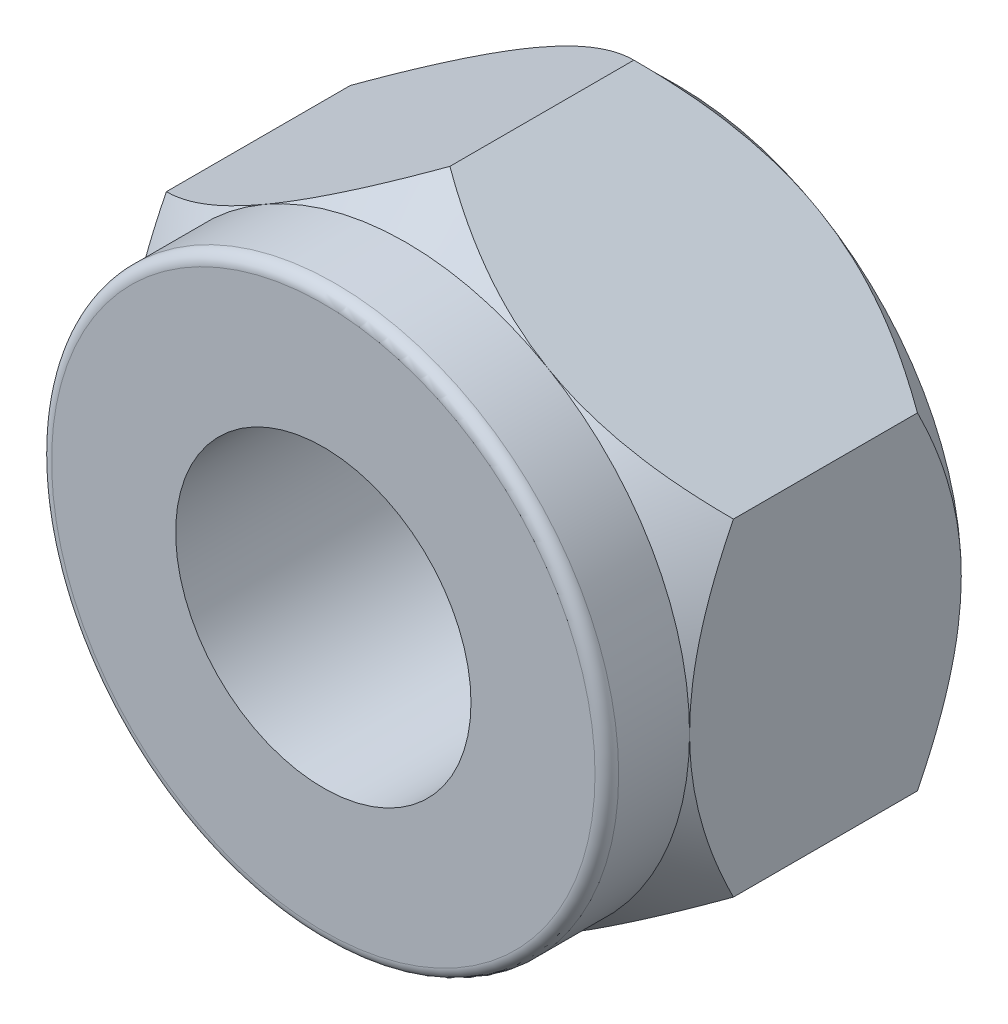
ISO-10303-21;
HEADER;
FILE_DESCRIPTION(('STEP AP214'),'2;1');
FILE_NAME('part.step','',(''),(''),'','','');
FILE_SCHEMA(('AUTOMOTIVE_DESIGN { 1 0 10303 214 1 1 1 1 }'));
ENDSEC;
DATA;
#1=APPLICATION_CONTEXT('core data for automotive mechanical design processes');
#2=APPLICATION_PROTOCOL_DEFINITION('international standard','automotive_design',2000,#1);
#3=PRODUCT_CONTEXT('',#1,'mechanical');
#4=PRODUCT('Part','Part','',(#3));
#5=PRODUCT_RELATED_PRODUCT_CATEGORY('part','',(#4));
#6=PRODUCT_DEFINITION_FORMATION('','',#4);
#7=PRODUCT_DEFINITION_CONTEXT('part definition',#1,'design');
#8=PRODUCT_DEFINITION('design','',#6,#7);
#9=PRODUCT_DEFINITION_SHAPE('','',#8);
#10=(LENGTH_UNIT() NAMED_UNIT(*) SI_UNIT(.MILLI.,.METRE.));
#11=(NAMED_UNIT(*) PLANE_ANGLE_UNIT() SI_UNIT($,.RADIAN.));
#12=(NAMED_UNIT(*) SI_UNIT($,.STERADIAN.) SOLID_ANGLE_UNIT());
#13=UNCERTAINTY_MEASURE_WITH_UNIT(LENGTH_MEASURE(1.E-05),#10,'distance_accuracy_value','');
#14=(GEOMETRIC_REPRESENTATION_CONTEXT(3) GLOBAL_UNCERTAINTY_ASSIGNED_CONTEXT((#13)) GLOBAL_UNIT_ASSIGNED_CONTEXT((#10,
#11,#12)) REPRESENTATION_CONTEXT('',''));
#15=CARTESIAN_POINT('',(0.,0.,0.));
#16=DIRECTION('',(0.,0.,1.));
#17=DIRECTION('',(1.,0.,0.));
#18=AXIS2_PLACEMENT_3D('',#15,#16,#17);
#19=CARTESIAN_POINT('',(2.4,1.3856406460551,2.3));
#20=DIRECTION('',(-0.5,-0.866025403784439,0.));
#21=DIRECTION('',(0.866025403784439,-0.5,0.));
#22=AXIS2_PLACEMENT_3D('',#19,#20,#21);
#23=PLANE('',#22);
#24=CARTESIAN_POINT('',(2.400225,1.38551074224453,1.9285887949458));
#25=CARTESIAN_POINT('',(2.31772226361059,1.43314371930784,1.97618269691781));
#26=CARTESIAN_POINT('',(2.23383994260048,1.48157319992328,2.02098147814882));
#27=CARTESIAN_POINT('',(2.06279448648971,1.58032634005249,2.10300722565923));
#28=CARTESIAN_POINT('',(1.97561508192357,1.63065939274654,2.14018854883754));
#29=CARTESIAN_POINT('',(1.79982194236265,1.73215360919373,2.20388101805169));
#30=CARTESIAN_POINT('',(1.7112529842582,1.78328892099718,2.23055226488237));
#31=CARTESIAN_POINT('',(1.53216510134971,1.886685358403,2.27164498132732));
#32=CARTESIAN_POINT('',(1.44165164852085,1.93894332475902,2.28609712881476));
#33=CARTESIAN_POINT('',(1.28565873476605,2.02900587550703,2.29913661889426));
#34=CARTESIAN_POINT('',(1.22038083817508,2.06669408667596,2.30106703138973));
#35=CARTESIAN_POINT('',(1.08993172717349,2.14200891602828,2.29781589873831));
#36=CARTESIAN_POINT('',(1.02476055818355,2.17963550798802,2.29263186018551));
#37=CARTESIAN_POINT('',(0.89503356361389,2.25453342322397,2.27544682831704));
#38=CARTESIAN_POINT('',(0.830478508767439,2.29180430151712,2.26343820832122));
#39=CARTESIAN_POINT('',(0.702484703713386,2.36570155931969,2.23326320244677));
#40=CARTESIAN_POINT('',(0.639045868327159,2.402327988007,2.21509728859333));
#41=CARTESIAN_POINT('',(0.476545316503685,2.49614772534575,2.16116553425461));
#42=CARTESIAN_POINT('',(0.378491349831642,2.55275920939896,2.12133366599793));
#43=CARTESIAN_POINT('',(0.234311769936506,2.63600132866307,2.05409168986329));
#44=CARTESIAN_POINT('',(0.186798185170518,2.66343330961787,2.03046590242826));
#45=CARTESIAN_POINT('',(0.0926511898287065,2.71778910272186,1.9810606043225));
#46=CARTESIAN_POINT('',(0.0460172600174095,2.74471321465178,1.95528241623806));
#47=CARTESIAN_POINT('',(-0.000224999999999834,2.77141119592077,1.9285887949458));
#48=B_SPLINE_CURVE_WITH_KNOTS('',3,(#24,#25,#26,#27,#28,#29,#30,#31,#32,#33,#34,#35,#36,#37,#38,
#39,#40,#41,#42,#43,#44,#45,#46,#47),.UNSPECIFIED.,.F.,.F.,(4,2,2,2,2,2,2,2,2,2,2,4),(0.,
0.319700631801913,0.641264200293265,0.957720168177908,1.27337924669043,1.49926250316193,
1.72522494529284,1.951440405382,2.17763852745645,2.53695946203074,2.71613279169855,
2.89519682366906),.UNSPECIFIED.);
#49=CARTESIAN_POINT('',(2.4,1.3856406460551,1.9287187078898));
#50=VERTEX_POINT('',#49);
#51=CARTESIAN_POINT('',(1.2,2.07846096908265,2.3));
#52=VERTEX_POINT('',#51);
#53=EDGE_CURVE('E131',#50,#52,#48,.T.);
#54=ORIENTED_EDGE('',*,*,#53,.F.);
#55=DIRECTION('',(0.,0.,-1.));
#56=VECTOR('',#55,1.);
#57=CARTESIAN_POINT('',(2.4,1.3856406460551,2.3));
#58=LINE('',#57,#56);
#59=CARTESIAN_POINT('',(2.4,1.3856406460551,0.371274007665088));
#60=VERTEX_POINT('',#59);
#61=EDGE_CURVE('E160',#50,#60,#58,.T.);
#62=ORIENTED_EDGE('',*,*,#61,.T.);
#63=CARTESIAN_POINT('',(-0.0002,2.77139676216404,0.371389484935504));
#64=CARTESIAN_POINT('',(0.0823012290219648,2.72376465537974,0.323797189948385));
#65=CARTESIAN_POINT('',(0.166182002218614,2.67533606839482,0.278999989178173));
#66=CARTESIAN_POINT('',(0.337224213782115,2.57658480150584,0.196977256711161));
#67=CARTESIAN_POINT('',(0.424401919980798,2.5262527293647,0.159797364335556));
#68=CARTESIAN_POINT('',(0.600191618602269,2.42476049954483,0.0961074141049489));
#69=CARTESIAN_POINT('',(0.688758838546548,2.37362619126862,0.0694372679428527));
#70=CARTESIAN_POINT('',(0.867843133228609,2.2702318255263,0.0283463117495389));
#71=CARTESIAN_POINT('',(0.958354736660034,2.21797492692038,0.0138948268502028));
#72=CARTESIAN_POINT('',(1.11434570656907,2.12791349845225,0.000855887820635021));
#73=CARTESIAN_POINT('',(1.17962353089486,2.09022532900564,-0.00107436222053681));
#74=CARTESIAN_POINT('',(1.31007248382727,2.01491059091461,0.00217707691950548));
#75=CARTESIAN_POINT('',(1.37524356700993,1.97728404849572,0.00736125943327144));
#76=CARTESIAN_POINT('',(1.50497037588312,1.90238624047167,0.0245465518295103));
#77=CARTESIAN_POINT('',(1.56952533088676,1.86511541982279,0.0365552878068237));
#78=CARTESIAN_POINT('',(1.69751893288234,1.7912182792561,0.066730495215164));
#79=CARTESIAN_POINT('',(1.76095766505766,1.75459191015763,0.0848964945983144));
#80=CARTESIAN_POINT('',(1.92345302377046,1.66077517106273,0.1388267974023));
#81=CARTESIAN_POINT('',(2.02150206458703,1.6041665309535,0.178656440753965));
#82=CARTESIAN_POINT('',(2.1656745393029,1.52092851386656,0.245894409608793));
#83=CARTESIAN_POINT('',(2.21318580224688,1.49349787341631,0.269518749879775));
#84=CARTESIAN_POINT('',(2.30732824280802,1.43914471001617,0.318920980646706));
#85=CARTESIAN_POINT('',(2.35395993949604,1.41222188738057,0.344697548957831));
#86=CARTESIAN_POINT('',(2.4002,1.38552517600126,0.371389484935503));
#87=B_SPLINE_CURVE_WITH_KNOTS('',3,(#63,#64,#65,#66,#67,#68,#69,#70,#71,#72,#73,#74,#75,#76,#77,
#78,#79,#80,#81,#82,#83,#84,#85,#86),.UNSPECIFIED.,.F.,.F.,(4,2,2,2,2,2,2,2,2,2,2,4),(0.,
0.319693790797099,0.64125036481395,0.957699700318646,1.2733522128152,1.49923520651956,
1.72519738366798,1.95141256006821,2.17761039755628,2.53691313596383,2.71607736387025,
2.89513232388091),.UNSPECIFIED.);
#88=CARTESIAN_POINT('',(1.20000182111127,2.07846412333992,-3.64222270296016E-06));
#89=VERTEX_POINT('',#88);
#90=EDGE_CURVE('E313',#89,#60,#87,.T.);
#91=ORIENTED_EDGE('',*,*,#90,.F.);
#92=CARTESIAN_POINT('',(0.,2.7712812921102,0.371274007665088));
#93=VERTEX_POINT('',#92);
#94=EDGE_CURVE('E327',#93,#89,#87,.T.);
#95=ORIENTED_EDGE('',*,*,#94,.F.);
#96=DIRECTION('',(0.,0.,-1.));
#97=VECTOR('',#96,1.);
#98=CARTESIAN_POINT('',(0.,2.7712812921102,2.3));
#99=LINE('',#98,#97);
#100=CARTESIAN_POINT('',(0.,2.7712812921102,1.9287187078898));
#101=VERTEX_POINT('',#100);
#102=EDGE_CURVE('E164',#101,#93,#99,.T.);
#103=ORIENTED_EDGE('',*,*,#102,.F.);
#104=EDGE_CURVE('E143',#52,#101,#48,.T.);
#105=ORIENTED_EDGE('',*,*,#104,.F.);
#106=EDGE_LOOP('',(#54,#62,#91,#95,#103,#105));
#107=FACE_BOUND('',#106,.T.);
#108=ADVANCED_FACE('F40',(#107),#23,.F.);
#109=CARTESIAN_POINT('',(0.,2.7712812921102,2.3));
#110=DIRECTION('',(0.5,-0.866025403784439,0.));
#111=DIRECTION('',(0.866025403784438,0.5,0.));
#112=AXIS2_PLACEMENT_3D('',#109,#110,#111);
#113=PLANE('',#112);
#114=CARTESIAN_POINT('',(0.000225000000000114,2.77141119592077,1.9285887949458));
#115=CARTESIAN_POINT('',(-0.0822777363894048,2.72377821885747,1.97618269691781));
#116=CARTESIAN_POINT('',(-0.166160057399522,2.67534873824203,2.02098147814882));
#117=CARTESIAN_POINT('',(-0.337205513510287,2.57659559811281,2.10300722565924));
#118=CARTESIAN_POINT('',(-0.424384918076426,2.52626254541876,2.14018854883754));
#119=CARTESIAN_POINT('',(-0.600178057637348,2.42476832897157,2.20388101805169));
#120=CARTESIAN_POINT('',(-0.688747015741804,2.37363301716812,2.23055226488237));
#121=CARTESIAN_POINT('',(-0.867834898650292,2.27023657976231,2.27164498132732));
#122=CARTESIAN_POINT('',(-0.958348351479144,2.21797861340629,2.28609712881476));
#123=CARTESIAN_POINT('',(-1.11434126523395,2.12791606265827,2.29913661889426));
#124=CARTESIAN_POINT('',(-1.17961916182492,2.09022785148934,2.30106703138973));
#125=CARTESIAN_POINT('',(-1.31006827282651,2.01491302213703,2.29781589873831));
#126=CARTESIAN_POINT('',(-1.37523944181645,1.97728643017728,2.29263186018552));
#127=CARTESIAN_POINT('',(-1.50496643638611,1.90238851494133,2.27544682831704));
#128=CARTESIAN_POINT('',(-1.56952149123256,1.86511763664818,2.26343820832122));
#129=CARTESIAN_POINT('',(-1.69751529628661,1.79122037884562,2.23326320244677));
#130=CARTESIAN_POINT('',(-1.76095413167284,1.75459395015831,2.21509728859333));
#131=CARTESIAN_POINT('',(-1.92345468349631,1.66077421281956,2.16116553425461));
#132=CARTESIAN_POINT('',(-2.02150865016836,1.60416272876634,2.12133366599793));
#133=CARTESIAN_POINT('',(-2.16568823006349,1.52092060950224,2.05409168986329));
#134=CARTESIAN_POINT('',(-2.21320181482948,1.49348862854743,2.03046590242826));
#135=CARTESIAN_POINT('',(-2.30734881017129,1.43913283544344,1.9810606043225));
#136=CARTESIAN_POINT('',(-2.35398273998259,1.41220872351352,1.95528241623806));
#137=CARTESIAN_POINT('',(-2.400225,1.38551074224453,1.9285887949458));
#138=B_SPLINE_CURVE_WITH_KNOTS('',3,(#114,#115,#116,#117,#118,#119,#120,#121,#122,#123,#124,
#125,#126,#127,#128,#129,#130,#131,#132,#133,#134,#135,#136,#137),.UNSPECIFIED.,.F.,.F.,(4,2,2,
2,2,2,2,2,2,2,2,4),(0.,0.319700631801913,0.641264200293264,0.957720168177907,1.27337924669043,
1.49926250316193,1.72522494529284,1.951440405382,2.17763852745645,2.53695946203074,
2.71613279169855,2.89519682366906),.UNSPECIFIED.);
#139=CARTESIAN_POINT('',(-1.2,2.07846096908265,2.3));
#140=VERTEX_POINT('',#139);
#141=EDGE_CURVE('E150',#101,#140,#138,.T.);
#142=ORIENTED_EDGE('',*,*,#141,.F.);
#143=ORIENTED_EDGE('',*,*,#102,.T.);
#144=CARTESIAN_POINT('',(-2.4002,1.38552517600126,0.371389484935503));
#145=CARTESIAN_POINT('',(-2.31769877097804,1.43315728278557,0.323797189948385));
#146=CARTESIAN_POINT('',(-2.23381799778139,1.48158586977049,0.278999989178173));
#147=CARTESIAN_POINT('',(-2.06277578621789,1.58033713665947,0.196977256711161));
#148=CARTESIAN_POINT('',(-1.9755980800192,1.63066920880061,0.159797364335555));
#149=CARTESIAN_POINT('',(-1.79980838139773,1.73216143862048,0.0961074141049486));
#150=CARTESIAN_POINT('',(-1.71124116145345,1.78329574689669,0.0694372679428527));
#151=CARTESIAN_POINT('',(-1.53215686677139,1.88669011263901,0.0283463117495388));
#152=CARTESIAN_POINT('',(-1.44164526333997,1.93894701124492,0.0138948268502023));
#153=CARTESIAN_POINT('',(-1.28565429343093,2.02900843971306,0.000855887820634611));
#154=CARTESIAN_POINT('',(-1.22037646910515,2.06669660915966,-0.00107436222053701));
#155=CARTESIAN_POINT('',(-1.08992751617273,2.1420113472507,0.00217707691950525));
#156=CARTESIAN_POINT('',(-1.02475643299007,2.17963788966959,0.00736125943327096));
#157=CARTESIAN_POINT('',(-0.895029624116876,2.25453569769364,0.0245465518295099));
#158=CARTESIAN_POINT('',(-0.830474669113238,2.29180651834251,0.0365552878068237));
#159=CARTESIAN_POINT('',(-0.702481067117664,2.36570365890921,0.0667304952151638));
#160=CARTESIAN_POINT('',(-0.639042334942346,2.40233002800767,0.0848964945983138));
#161=CARTESIAN_POINT('',(-0.476546976229544,2.49614676710257,0.138826797402299));
#162=CARTESIAN_POINT('',(-0.378497935412973,2.55275540721181,0.178656440753965));
#163=CARTESIAN_POINT('',(-0.234325460697104,2.63599342429875,0.245894409608793));
#164=CARTESIAN_POINT('',(-0.186814197753125,2.66342406474899,0.269518749879774));
#165=CARTESIAN_POINT('',(-0.0926717571919817,2.71777722814914,0.318920980646706));
#166=CARTESIAN_POINT('',(-0.0460400605039591,2.74470005078474,0.344697548957831));
#167=CARTESIAN_POINT('',(0.000200000000000176,2.77139676216404,0.371389484935504));
#168=B_SPLINE_CURVE_WITH_KNOTS('',3,(#144,#145,#146,#147,#148,#149,#150,#151,#152,#153,#154,
#155,#156,#157,#158,#159,#160,#161,#162,#163,#164,#165,#166,#167),.UNSPECIFIED.,.F.,.F.,(4,2,2,
2,2,2,2,2,2,2,2,4),(0.,0.319693790797099,0.64125036481395,0.957699700318646,1.2733522128152,
1.49923520651956,1.72519738366798,1.95141256006821,2.17761039755628,2.53691313596383,
2.71607736387025,2.89513232388091),.UNSPECIFIED.);
#169=CARTESIAN_POINT('',(-1.20000182111129,2.07846412333991,-3.64222270290595E-06));
#170=VERTEX_POINT('',#169);
#171=EDGE_CURVE('E441',#170,#93,#168,.T.);
#172=ORIENTED_EDGE('',*,*,#171,.F.);
#173=CARTESIAN_POINT('',(-2.4,1.3856406460551,0.371274007665088));
#174=VERTEX_POINT('',#173);
#175=EDGE_CURVE('E433',#174,#170,#168,.T.);
#176=ORIENTED_EDGE('',*,*,#175,.F.);
#177=DIRECTION('',(0.,0.,-1.));
#178=VECTOR('',#177,1.);
#179=CARTESIAN_POINT('',(-2.4,1.3856406460551,2.3));
#180=LINE('',#179,#178);
#181=CARTESIAN_POINT('',(-2.4,1.3856406460551,1.9287187078898));
#182=VERTEX_POINT('',#181);
#183=EDGE_CURVE('E278',#182,#174,#180,.T.);
#184=ORIENTED_EDGE('',*,*,#183,.F.);
#185=EDGE_CURVE('E167',#140,#182,#138,.T.);
#186=ORIENTED_EDGE('',*,*,#185,.F.);
#187=EDGE_LOOP('',(#142,#143,#172,#176,#184,#186));
#188=FACE_BOUND('',#187,.T.);
#189=ADVANCED_FACE('F229',(#188),#113,.F.);
#190=CARTESIAN_POINT('',(-2.4,1.3856406460551,2.3));
#191=DIRECTION('',(1.,0.,0.));
#192=DIRECTION('',(0.,0.,-1.));
#193=AXIS2_PLACEMENT_3D('',#190,#191,#192);
#194=PLANE('',#193);
#195=CARTESIAN_POINT('',(-2.4,1.3858656460551,1.92860620103968));
#196=CARTESIAN_POINT('',(-2.4,1.29060179063543,1.9761981653612));
#197=CARTESIAN_POINT('',(-2.4,1.19374498442452,2.02099504092357));
#198=CARTESIAN_POINT('',(-2.4,0.996243221547423,2.10301715299163));
#199=CARTESIAN_POINT('',(-2.4,0.895579480795219,2.14019675095386));
#200=CARTESIAN_POINT('',(-2.4,0.692595838719089,2.20388618285687));
#201=CARTESIAN_POINT('',(-2.4,0.590327635151999,2.23055610253527));
#202=CARTESIAN_POINT('',(-2.4,0.383539756226781,2.27164669652072));
#203=CARTESIAN_POINT('',(-2.4,0.279026398430142,2.28609804507758));
#204=CARTESIAN_POINT('',(-2.4,0.0989040033476916,2.29913687071086));
#205=CARTESIAN_POINT('',(-2.4,0.0235276816223925,2.30106708732014));
#206=CARTESIAN_POINT('',(-2.4,-0.127101757006664,2.29781558510622));
#207=CARTESIAN_POINT('',(-2.4,-0.202354821458544,2.29263137296556));
#208=CARTESIAN_POINT('',(-2.4,-0.35215039338856,2.27544602695228));
#209=CARTESIAN_POINT('',(-2.4,-0.426692010965138,2.26343726710527));
#210=CARTESIAN_POINT('',(-2.4,-0.57448624385448,2.23326201821899));
#211=CARTESIAN_POINT('',(-2.4,-0.647738957529669,2.21509600123228));
#212=CARTESIAN_POINT('',(-2.4,-0.835371201794038,2.16116599711134));
#213=CARTESIAN_POINT('',(-2.4,-0.948587311586011,2.12133681158238));
#214=CARTESIAN_POINT('',(-2.4,-1.11506165750506,2.05409966731303));
#215=CARTESIAN_POINT('',(-2.4,-1.16992238671944,2.03047562482769));
#216=CARTESIAN_POINT('',(-2.4,-1.27862763126161,1.9810740252332));
#217=CARTESIAN_POINT('',(-2.4,-1.33247274592169,1.95529779022629));
#218=CARTESIAN_POINT('',(-2.4,-1.3858656460551,1.92860620103968));
#219=B_SPLINE_CURVE_WITH_KNOTS('',3,(#195,#196,#197,#198,#199,#200,#201,#202,#203,#204,#205,
#206,#207,#208,#209,#210,#211,#212,#213,#214,#215,#216,#217,#218),.UNSPECIFIED.,.F.,.F.,(4,2,2,
2,2,2,2,2,2,2,2,4),(0.,0.31969238314533,0.641247517932364,0.957695488712028,1.27334665013864,
1.49922958978071,1.72519171241104,1.95140683044389,2.17760460937986,2.53690360347334,
2.71606595846664,2.89511905169603),.UNSPECIFIED.);
#220=CARTESIAN_POINT('',(-2.4,0.,2.3));
#221=VERTEX_POINT('',#220);
#222=EDGE_CURVE('E223',#182,#221,#219,.T.);
#223=ORIENTED_EDGE('',*,*,#222,.F.);
#224=ORIENTED_EDGE('',*,*,#183,.T.);
#225=CARTESIAN_POINT('',(-2.4,-4.33202461858635,2.5524100340003));
#226=CARTESIAN_POINT('',(-2.4,-4.20467817352178,2.44105807588942));
#227=CARTESIAN_POINT('',(-2.4,-4.07679375117089,2.33030928191229));
#228=CARTESIAN_POINT('',(-2.4,-3.81952744564485,2.11044929575524));
#229=CARTESIAN_POINT('',(-2.4,-3.69014491727787,2.00133885944401));
#230=CARTESIAN_POINT('',(-2.4,-3.42690641346845,1.78307538860849));
#231=CARTESIAN_POINT('',(-2.4,-3.29301308680823,1.67396723525418));
#232=CARTESIAN_POINT('',(-2.4,-3.02281106446473,1.45883829376592));
#233=CARTESIAN_POINT('',(-2.4,-2.88650297005449,1.35281675397838));
#234=CARTESIAN_POINT('',(-2.4,-2.61051182637548,1.14491981190419));
#235=CARTESIAN_POINT('',(-2.4,-2.47082531257604,1.04304898068681));
#236=CARTESIAN_POINT('',(-2.4,-2.18699883504318,0.84538363520462));
#237=CARTESIAN_POINT('',(-2.4,-2.04285545038019,0.749593969900597));
#238=CARTESIAN_POINT('',(-2.4,-1.74967851022209,0.567851217213569));
#239=CARTESIAN_POINT('',(-2.4,-1.60068134540473,0.48184013955532));
#240=CARTESIAN_POINT('',(-2.4,-1.29531232289618,0.324104551635456));
#241=CARTESIAN_POINT('',(-2.4,-1.13895393419677,0.252355113881703));
#242=CARTESIAN_POINT('',(-2.4,-0.896222228816197,0.160747646978908));
#243=CARTESIAN_POINT('',(-2.4,-0.812972383051711,0.132662179925447));
#244=CARTESIAN_POINT('',(-2.4,-0.644357672516691,0.0836775937029816));
#245=CARTESIAN_POINT('',(-2.4,-0.558993143122039,0.0627773427263272));
#246=CARTESIAN_POINT('',(-2.4,-0.387220462806769,0.0295817076216501));
#247=CARTESIAN_POINT('',(-2.4,-0.30082445531428,0.017224709069998));
#248=CARTESIAN_POINT('',(-2.4,-0.127200799384861,0.00180685336911782));
#249=CARTESIAN_POINT('',(-2.4,-0.0399732855922029,-0.00125548403298988));
#250=CARTESIAN_POINT('',(-2.4,0.134597937865097,0.00217350377839942));
#251=CARTESIAN_POINT('',(-2.4,0.221940968544996,0.00869863414765547));
#252=CARTESIAN_POINT('',(-2.4,0.395461089718313,0.0308307110618702));
#253=CARTESIAN_POINT('',(-2.4,0.481637916880342,0.0464396748656149));
#254=CARTESIAN_POINT('',(-2.4,0.652798601850143,0.0857811139573866));
#255=CARTESIAN_POINT('',(-2.4,0.737767639591556,0.109576844200713));
#256=CARTESIAN_POINT('',(-2.4,0.905493180058136,0.16389911301093));
#257=CARTESIAN_POINT('',(-2.4,0.988249574164251,0.194425981332796));
#258=CARTESIAN_POINT('',(-2.4,1.16564881943521,0.266653401508278));
#259=CARTESIAN_POINT('',(-2.4,1.25987251440282,0.309373314204903));
#260=CARTESIAN_POINT('',(-2.4,1.44553504438533,0.400533173918019));
#261=CARTESIAN_POINT('',(-2.4,1.5369722846408,0.448976321920787));
#262=CARTESIAN_POINT('',(-2.4,1.71756289500086,0.550319345773075));
#263=CARTESIAN_POINT('',(-2.4,1.80671132696718,0.603227948784848));
#264=CARTESIAN_POINT('',(-2.4,1.9828913735892,0.712400426942232));
#265=CARTESIAN_POINT('',(-2.4,2.06992339057028,0.768663657249677));
#266=CARTESIAN_POINT('',(-2.4,2.24270308946753,0.884131009451307));
#267=CARTESIAN_POINT('',(-2.4,2.32844100727084,0.943349674125387));
#268=CARTESIAN_POINT('',(-2.4,2.49843040495067,1.06388833281329));
#269=CARTESIAN_POINT('',(-2.4,2.5826817719149,1.12520848541552));
#270=CARTESIAN_POINT('',(-2.4,2.83337344993711,1.3115216708556));
#271=CARTESIAN_POINT('',(-2.4,2.99795770991826,1.43900839777539));
#272=CARTESIAN_POINT('',(-2.4,3.36150518885934,1.72855192655679));
#273=CARTESIAN_POINT('',(-2.4,3.55955297085279,1.891747933448));
#274=CARTESIAN_POINT('',(-2.4,3.8526281134975,2.13872281443989));
#275=CARTESIAN_POINT('',(-2.4,3.94904077259863,2.22087130633386));
#276=CARTESIAN_POINT('',(-2.4,4.14108142575108,2.38603057922414));
#277=CARTESIAN_POINT('',(-2.4,4.23670961761373,2.46904113008279));
#278=CARTESIAN_POINT('',(-2.4,4.33202461858635,2.5524100340003));
#279=B_SPLINE_CURVE_WITH_KNOTS('',3,(#225,#226,#227,#228,#229,#230,#231,#232,#233,#234,#235,
#236,#237,#238,#239,#240,#241,#242,#243,#244,#245,#246,#247,#248,#249,#250,#251,#252,#253,#254,
#255,#256,#257,#258,#259,#260,#261,#262,#263,#264,#265,#266,#267,#268,#269,#270,#271,#272,#273,
#274,#275,#276,#277,#278),.UNSPECIFIED.,.F.,.F.,(4,2,2,2,2,2,2,2,2,2,2,2,2,2,2,2,2,2,2,2,2,2,2,
2,2,2,4),(0.,0.507501269714196,1.01522989863726,1.53335558795511,2.05135402935416,
2.56990830653687,3.08887100219693,3.60457495132795,4.11936943370993,4.38269287828901,
4.64597482541176,4.90733758450939,5.16865871720708,5.43090347521354,5.69320649249155,
5.95758348086858,6.22197342381628,6.5320822507959,6.84236534908505,7.15326955795855,
7.46411419521655,7.77667783410517,8.08926511271979,8.7136905375447,9.4834685503659,
9.86345717780873,10.2433468447755),.UNSPECIFIED.);
#280=CARTESIAN_POINT('',(-2.40000364222256,0.,-3.64222255719196E-06));
#281=VERTEX_POINT('',#280);
#282=EDGE_CURVE('E252',#281,#174,#279,.T.);
#283=ORIENTED_EDGE('',*,*,#282,.F.);
#284=CARTESIAN_POINT('',(-2.4,-1.3856406460551,0.371274007665088));
#285=VERTEX_POINT('',#284);
#286=EDGE_CURVE('E248',#285,#281,#279,.T.);
#287=ORIENTED_EDGE('',*,*,#286,.F.);
#288=DIRECTION('',(0.,0.,-1.));
#289=VECTOR('',#288,1.);
#290=CARTESIAN_POINT('',(-2.4,-1.3856406460551,2.3));
#291=LINE('',#290,#289);
#292=CARTESIAN_POINT('',(-2.4,-1.3856406460551,1.9287187078898));
#293=VERTEX_POINT('',#292);
#294=EDGE_CURVE('E275',#293,#285,#291,.T.);
#295=ORIENTED_EDGE('',*,*,#294,.F.);
#296=EDGE_CURVE('E216',#221,#293,#219,.T.);
#297=ORIENTED_EDGE('',*,*,#296,.F.);
#298=EDGE_LOOP('',(#223,#224,#283,#287,#295,#297));
#299=FACE_BOUND('',#298,.T.);
#300=ADVANCED_FACE('F225',(#299),#194,.F.);
#301=CARTESIAN_POINT('',(-2.4,-1.3856406460551,2.3));
#302=DIRECTION('',(0.5,0.866025403784439,0.));
#303=DIRECTION('',(-0.866025403784438,0.5,0.));
#304=AXIS2_PLACEMENT_3D('',#301,#302,#303);
#305=PLANE('',#304);
#306=CARTESIAN_POINT('',(-2.400225,-1.38551074224453,1.9285887949458));
#307=CARTESIAN_POINT('',(-2.3177222636106,-1.43314371930784,1.97618269691781));
#308=CARTESIAN_POINT('',(-2.23383994260048,-1.48157319992328,2.02098147814882));
#309=CARTESIAN_POINT('',(-2.06279448648971,-1.58032634005249,2.10300722565924));
#310=CARTESIAN_POINT('',(-1.97561508192357,-1.63065939274654,2.14018854883754));
#311=CARTESIAN_POINT('',(-1.79982194236265,-1.73215360919373,2.20388101805169));
#312=CARTESIAN_POINT('',(-1.7112529842582,-1.78328892099718,2.23055226488237));
#313=CARTESIAN_POINT('',(-1.53216510134971,-1.886685358403,2.27164498132732));
#314=CARTESIAN_POINT('',(-1.44165164852086,-1.93894332475902,2.28609712881476));
#315=CARTESIAN_POINT('',(-1.28565873476605,-2.02900587550703,2.29913661889426));
#316=CARTESIAN_POINT('',(-1.22038083817508,-2.06669408667596,2.30106703138973));
#317=CARTESIAN_POINT('',(-1.08993172717349,-2.14200891602828,2.29781589873831));
#318=CARTESIAN_POINT('',(-1.02476055818355,-2.17963550798802,2.29263186018552));
#319=CARTESIAN_POINT('',(-0.895033563613891,-2.25453342322397,2.27544682831704));
#320=CARTESIAN_POINT('',(-0.830478508767439,-2.29180430151712,2.26343820832122));
#321=CARTESIAN_POINT('',(-0.702484703713387,-2.36570155931969,2.23326320244677));
#322=CARTESIAN_POINT('',(-0.63904586832716,-2.402327988007,2.21509728859333));
#323=CARTESIAN_POINT('',(-0.476545316503686,-2.49614772534574,2.16116553425461));
#324=CARTESIAN_POINT('',(-0.378491349831642,-2.55275920939896,2.12133366599793));
#325=CARTESIAN_POINT('',(-0.234311769936506,-2.63600132866307,2.05409168986329));
#326=CARTESIAN_POINT('',(-0.186798185170518,-2.66343330961787,2.03046590242826));
#327=CARTESIAN_POINT('',(-0.0926511898287062,-2.71778910272186,1.9810606043225));
#328=CARTESIAN_POINT('',(-0.0460172600174092,-2.74471321465178,1.95528241623806));
#329=CARTESIAN_POINT('',(0.000225000000000178,-2.77141119592077,1.9285887949458));
#330=B_SPLINE_CURVE_WITH_KNOTS('',3,(#306,#307,#308,#309,#310,#311,#312,#313,#314,#315,#316,
#317,#318,#319,#320,#321,#322,#323,#324,#325,#326,#327,#328,#329),.UNSPECIFIED.,.F.,.F.,(4,2,2,
2,2,2,2,2,2,2,2,4),(0.,0.319700631801913,0.641264200293264,0.957720168177907,1.27337924669043,
1.49926250316193,1.72522494529284,1.951440405382,2.17763852745645,2.53695946203074,
2.71613279169855,2.89519682366906),.UNSPECIFIED.);
#331=CARTESIAN_POINT('',(-1.2,-2.07846096908265,2.3));
#332=VERTEX_POINT('',#331);
#333=EDGE_CURVE('E224',#293,#332,#330,.T.);
#334=ORIENTED_EDGE('',*,*,#333,.F.);
#335=ORIENTED_EDGE('',*,*,#294,.T.);
#336=CARTESIAN_POINT('',(0.0002,-2.77139676216404,0.371389484935503));
#337=CARTESIAN_POINT('',(-0.0823012290219647,-2.72376465537974,0.323797189948385));
#338=CARTESIAN_POINT('',(-0.166182002218613,-2.67533606839482,0.278999989178173));
#339=CARTESIAN_POINT('',(-0.337224213782115,-2.57658480150584,0.196977256711161));
#340=CARTESIAN_POINT('',(-0.424401919980798,-2.5262527293647,0.159797364335555));
#341=CARTESIAN_POINT('',(-0.600191618602268,-2.42476049954483,0.0961074141049486));
#342=CARTESIAN_POINT('',(-0.688758838546548,-2.37362619126862,0.0694372679428526));
#343=CARTESIAN_POINT('',(-0.867843133228608,-2.2702318255263,0.0283463117495387));
#344=CARTESIAN_POINT('',(-0.958354736660034,-2.21797492692038,0.0138948268502022));
#345=CARTESIAN_POINT('',(-1.11434570656907,-2.12791349845225,0.000855887820634346));
#346=CARTESIAN_POINT('',(-1.17962353089485,-2.09022532900564,-0.00107436222053735));
#347=CARTESIAN_POINT('',(-1.31007248382727,-2.01491059091461,0.00217707691950494));
#348=CARTESIAN_POINT('',(-1.37524356700993,-1.97728404849572,0.00736125943327077));
#349=CARTESIAN_POINT('',(-1.50497037588312,-1.90238624047167,0.0245465518295097));
#350=CARTESIAN_POINT('',(-1.56952533088676,-1.86511541982279,0.0365552878068233));
#351=CARTESIAN_POINT('',(-1.69751893288234,-1.7912182792561,0.0667304952151633));
#352=CARTESIAN_POINT('',(-1.76095766505765,-1.75459191015763,0.0848964945983132));
#353=CARTESIAN_POINT('',(-1.92345302377046,-1.66077517106273,0.138826797402299));
#354=CARTESIAN_POINT('',(-2.02150206458703,-1.6041665309535,0.178656440753965));
#355=CARTESIAN_POINT('',(-2.1656745393029,-1.52092851386656,0.245894409608793));
#356=CARTESIAN_POINT('',(-2.21318580224687,-1.49349787341631,0.269518749879774));
#357=CARTESIAN_POINT('',(-2.30732824280802,-1.43914471001617,0.318920980646705));
#358=CARTESIAN_POINT('',(-2.35395993949604,-1.41222188738057,0.34469754895783));
#359=CARTESIAN_POINT('',(-2.4002,-1.38552517600126,0.371389484935503));
#360=B_SPLINE_CURVE_WITH_KNOTS('',3,(#336,#337,#338,#339,#340,#341,#342,#343,#344,#345,#346,
#347,#348,#349,#350,#351,#352,#353,#354,#355,#356,#357,#358,#359),.UNSPECIFIED.,.F.,.F.,(4,2,2,
2,2,2,2,2,2,2,2,4),(0.,0.319693790797099,0.64125036481395,0.957699700318646,1.2733522128152,
1.49923520651956,1.72519738366798,1.95141256006821,2.17761039755628,2.53691313596383,
2.71607736387025,2.89513232388091),.UNSPECIFIED.);
#361=CARTESIAN_POINT('',(-1.20000182111127,-2.07846412333992,-3.64222270290595E-06));
#362=VERTEX_POINT('',#361);
#363=EDGE_CURVE('E258',#362,#285,#360,.T.);
#364=ORIENTED_EDGE('',*,*,#363,.F.);
#365=CARTESIAN_POINT('',(0.,-2.7712812921102,0.371274007665088));
#366=VERTEX_POINT('',#365);
#367=EDGE_CURVE('E358',#366,#362,#360,.T.);
#368=ORIENTED_EDGE('',*,*,#367,.F.);
#369=DIRECTION('',(0.,0.,-1.));
#370=VECTOR('',#369,1.);
#371=CARTESIAN_POINT('',(0.,-2.7712812921102,2.3));
#372=LINE('',#371,#370);
#373=CARTESIAN_POINT('',(0.,-2.7712812921102,1.9287187078898));
#374=VERTEX_POINT('',#373);
#375=EDGE_CURVE('E272',#374,#366,#372,.T.);
#376=ORIENTED_EDGE('',*,*,#375,.F.);
#377=EDGE_CURVE('E210',#332,#374,#330,.T.);
#378=ORIENTED_EDGE('',*,*,#377,.F.);
#379=EDGE_LOOP('',(#334,#335,#364,#368,#376,#378));
#380=FACE_BOUND('',#379,.T.);
#381=ADVANCED_FACE('F228',(#380),#305,.F.);
#382=CARTESIAN_POINT('',(0.,-2.7712812921102,2.3));
#383=DIRECTION('',(-0.5,0.866025403784439,0.));
#384=DIRECTION('',(-0.866025403784439,-0.5,0.));
#385=AXIS2_PLACEMENT_3D('',#382,#383,#384);
#386=PLANE('',#385);
#387=CARTESIAN_POINT('',(-0.000225000000000219,-2.77141119592077,1.9285887949458));
#388=CARTESIAN_POINT('',(0.0822777363894047,-2.72377821885747,1.97618269691781));
#389=CARTESIAN_POINT('',(0.166160057399522,-2.67534873824203,2.02098147814882));
#390=CARTESIAN_POINT('',(0.337205513510287,-2.57659559811281,2.10300722565923));
#391=CARTESIAN_POINT('',(0.424384918076426,-2.52626254541876,2.14018854883754));
#392=CARTESIAN_POINT('',(0.600178057637348,-2.42476832897157,2.20388101805169));
#393=CARTESIAN_POINT('',(0.688747015741804,-2.37363301716812,2.23055226488237));
#394=CARTESIAN_POINT('',(0.867834898650292,-2.27023657976231,2.27164498132732));
#395=CARTESIAN_POINT('',(0.958348351479144,-2.21797861340629,2.28609712881476));
#396=CARTESIAN_POINT('',(1.11434126523395,-2.12791606265827,2.29913661889426));
#397=CARTESIAN_POINT('',(1.17961916182492,-2.09022785148934,2.30106703138973));
#398=CARTESIAN_POINT('',(1.31006827282651,-2.01491302213703,2.2978158987383));
#399=CARTESIAN_POINT('',(1.37523944181645,-1.97728643017728,2.29263186018552));
#400=CARTESIAN_POINT('',(1.50496643638611,-1.90238851494133,2.27544682831704));
#401=CARTESIAN_POINT('',(1.56952149123256,-1.86511763664818,2.26343820832122));
#402=CARTESIAN_POINT('',(1.69751529628661,-1.79122037884562,2.23326320244677));
#403=CARTESIAN_POINT('',(1.76095413167284,-1.75459395015831,2.21509728859333));
#404=CARTESIAN_POINT('',(1.92345468349631,-1.66077421281956,2.16116553425461));
#405=CARTESIAN_POINT('',(2.02150865016836,-1.60416272876635,2.12133366599793));
#406=CARTESIAN_POINT('',(2.16568823006349,-1.52092060950224,2.05409168986329));
#407=CARTESIAN_POINT('',(2.21320181482948,-1.49348862854743,2.03046590242826));
#408=CARTESIAN_POINT('',(2.30734881017129,-1.43913283544344,1.9810606043225));
#409=CARTESIAN_POINT('',(2.35398273998259,-1.41220872351352,1.95528241623806));
#410=CARTESIAN_POINT('',(2.400225,-1.38551074224453,1.9285887949458));
#411=B_SPLINE_CURVE_WITH_KNOTS('',3,(#387,#388,#389,#390,#391,#392,#393,#394,#395,#396,#397,
#398,#399,#400,#401,#402,#403,#404,#405,#406,#407,#408,#409,#410),.UNSPECIFIED.,.F.,.F.,(4,2,2,
2,2,2,2,2,2,2,2,4),(0.,0.319700631801913,0.641264200293265,0.957720168177907,1.27337924669043,
1.49926250316193,1.72522494529284,1.951440405382,2.17763852745644,2.53695946203074,
2.71613279169855,2.89519682366906),.UNSPECIFIED.);
#412=CARTESIAN_POINT('',(1.2,-2.07846096908265,2.3));
#413=VERTEX_POINT('',#412);
#414=EDGE_CURVE('E414',#374,#413,#411,.T.);
#415=ORIENTED_EDGE('',*,*,#414,.F.);
#416=ORIENTED_EDGE('',*,*,#375,.T.);
#417=CARTESIAN_POINT('',(2.4002,-1.38552517600126,0.371389484935504));
#418=CARTESIAN_POINT('',(2.31769877097804,-1.43315728278557,0.323797189948385));
#419=CARTESIAN_POINT('',(2.23381799778139,-1.48158586977049,0.278999989178173));
#420=CARTESIAN_POINT('',(2.06277578621789,-1.58033713665947,0.196977256711162));
#421=CARTESIAN_POINT('',(1.9755980800192,-1.63066920880061,0.159797364335556));
#422=CARTESIAN_POINT('',(1.79980838139773,-1.73216143862048,0.0961074141049493));
#423=CARTESIAN_POINT('',(1.71124116145345,-1.78329574689669,0.0694372679428534));
#424=CARTESIAN_POINT('',(1.53215686677139,-1.88669011263901,0.0283463117495394));
#425=CARTESIAN_POINT('',(1.44164526333997,-1.93894701124492,0.0138948268502027));
#426=CARTESIAN_POINT('',(1.28565429343093,-2.02900843971306,0.000855887820635049));
#427=CARTESIAN_POINT('',(1.22037646910515,-2.06669660915966,-0.0010743622205365));
#428=CARTESIAN_POINT('',(1.08992751617273,-2.1420113472507,0.00217707691950561));
#429=CARTESIAN_POINT('',(1.02475643299007,-2.17963788966959,0.00736125943327109));
#430=CARTESIAN_POINT('',(0.895029624116877,-2.25453569769364,0.0245465518295098));
#431=CARTESIAN_POINT('',(0.830474669113239,-2.29180651834251,0.0365552878068235));
#432=CARTESIAN_POINT('',(0.702481067117664,-2.36570365890921,0.0667304952151638));
#433=CARTESIAN_POINT('',(0.639042334942346,-2.40233002800767,0.0848964945983138));
#434=CARTESIAN_POINT('',(0.476546976229544,-2.49614676710257,0.138826797402299));
#435=CARTESIAN_POINT('',(0.378497935412973,-2.55275540721181,0.178656440753965));
#436=CARTESIAN_POINT('',(0.234325460697104,-2.63599342429875,0.245894409608793));
#437=CARTESIAN_POINT('',(0.186814197753125,-2.66342406474899,0.269518749879774));
#438=CARTESIAN_POINT('',(0.0926717571919815,-2.71777722814914,0.318920980646706));
#439=CARTESIAN_POINT('',(0.0460400605039589,-2.74470005078474,0.344697548957831));
#440=CARTESIAN_POINT('',(-0.000200000000000121,-2.77139676216404,0.371389484935504));
#441=B_SPLINE_CURVE_WITH_KNOTS('',3,(#417,#418,#419,#420,#421,#422,#423,#424,#425,#426,#427,
#428,#429,#430,#431,#432,#433,#434,#435,#436,#437,#438,#439,#440),.UNSPECIFIED.,.F.,.F.,(4,2,2,
2,2,2,2,2,2,2,2,4),(0.,0.3196937907971,0.64125036481395,0.957699700318645,1.2733522128152,
1.49923520651956,1.72519738366798,1.95141256006821,2.17761039755628,2.53691313596383,
2.71607736387025,2.89513232388091),.UNSPECIFIED.);
#442=CARTESIAN_POINT('',(1.20000182111129,-2.07846412333991,-3.64222270290595E-06));
#443=VERTEX_POINT('',#442);
#444=EDGE_CURVE('E333',#443,#366,#441,.T.);
#445=ORIENTED_EDGE('',*,*,#444,.F.);
#446=CARTESIAN_POINT('',(2.4,-1.3856406460551,0.371274007665088));
#447=VERTEX_POINT('',#446);
#448=EDGE_CURVE('E329',#447,#443,#441,.T.);
#449=ORIENTED_EDGE('',*,*,#448,.F.);
#450=DIRECTION('',(0.,0.,-1.));
#451=VECTOR('',#450,1.);
#452=CARTESIAN_POINT('',(2.4,-1.3856406460551,2.3));
#453=LINE('',#452,#451);
#454=CARTESIAN_POINT('',(2.4,-1.3856406460551,1.9287187078898));
#455=VERTEX_POINT('',#454);
#456=EDGE_CURVE('E269',#455,#447,#453,.T.);
#457=ORIENTED_EDGE('',*,*,#456,.F.);
#458=EDGE_CURVE('E202',#413,#455,#411,.T.);
#459=ORIENTED_EDGE('',*,*,#458,.F.);
#460=EDGE_LOOP('',(#415,#416,#445,#449,#457,#459));
#461=FACE_BOUND('',#460,.T.);
#462=ADVANCED_FACE('F374',(#461),#386,.F.);
#463=CARTESIAN_POINT('',(2.4,-1.3856406460551,2.3));
#464=DIRECTION('',(-1.,0.,0.));
#465=DIRECTION('',(0.,-1.,0.));
#466=AXIS2_PLACEMENT_3D('',#463,#464,#465);
#467=PLANE('',#466);
#468=CARTESIAN_POINT('',(2.4,-1.3858656460551,1.92860620103968));
#469=CARTESIAN_POINT('',(2.4,-1.29060179063543,1.9761981653612));
#470=CARTESIAN_POINT('',(2.4,-1.19374498442452,2.02099504092357));
#471=CARTESIAN_POINT('',(2.4,-0.996243221547424,2.10301715299163));
#472=CARTESIAN_POINT('',(2.4,-0.895579480795219,2.14019675095386));
#473=CARTESIAN_POINT('',(2.4,-0.692595838719089,2.20388618285687));
#474=CARTESIAN_POINT('',(2.4,-0.590327635151999,2.23055610253527));
#475=CARTESIAN_POINT('',(2.4,-0.383539756226782,2.27164669652072));
#476=CARTESIAN_POINT('',(2.4,-0.279026398430143,2.28609804507758));
#477=CARTESIAN_POINT('',(2.4,-0.0989040033476928,2.29913687071086));
#478=CARTESIAN_POINT('',(2.4,-0.0235276816223939,2.30106708732014));
#479=CARTESIAN_POINT('',(2.4,0.127101757006662,2.29781558510622));
#480=CARTESIAN_POINT('',(2.4,0.202354821458543,2.29263137296556));
#481=CARTESIAN_POINT('',(2.4,0.352150393388558,2.27544602695228));
#482=CARTESIAN_POINT('',(2.4,0.426692010965137,2.26343726710527));
#483=CARTESIAN_POINT('',(2.4,0.574486243854479,2.23326201821899));
#484=CARTESIAN_POINT('',(2.4,0.647738957529668,2.21509600123228));
#485=CARTESIAN_POINT('',(2.4,0.835371201794037,2.16116599711134));
#486=CARTESIAN_POINT('',(2.4,0.948587311586011,2.12133681158238));
#487=CARTESIAN_POINT('',(2.4,1.11506165750506,2.05409966731303));
#488=CARTESIAN_POINT('',(2.4,1.16992238671944,2.03047562482769));
#489=CARTESIAN_POINT('',(2.4,1.27862763126161,1.9810740252332));
#490=CARTESIAN_POINT('',(2.4,1.33247274592169,1.95529779022628));
#491=CARTESIAN_POINT('',(2.4,1.3858656460551,1.92860620103968));
#492=B_SPLINE_CURVE_WITH_KNOTS('',3,(#468,#469,#470,#471,#472,#473,#474,#475,#476,#477,#478,
#479,#480,#481,#482,#483,#484,#485,#486,#487,#488,#489,#490,#491),.UNSPECIFIED.,.F.,.F.,(4,2,2,
2,2,2,2,2,2,2,2,4),(0.,0.319692383145331,0.641247517932364,0.957695488712028,1.27334665013864,
1.49922958978071,1.72519171241104,1.95140683044389,2.17760460937986,2.53690360347334,
2.71606595846664,2.89511905169603),.UNSPECIFIED.);
#493=CARTESIAN_POINT('',(2.4,0.,2.3));
#494=VERTEX_POINT('',#493);
#495=EDGE_CURVE('E418',#455,#494,#492,.T.);
#496=ORIENTED_EDGE('',*,*,#495,.F.);
#497=ORIENTED_EDGE('',*,*,#456,.T.);
#498=CARTESIAN_POINT('',(2.4,4.33202461858635,2.5524100340003));
#499=CARTESIAN_POINT('',(2.4,4.20467817352178,2.44105807588942));
#500=CARTESIAN_POINT('',(2.4,4.07679375117089,2.33030928191229));
#501=CARTESIAN_POINT('',(2.4,3.81952744564485,2.11044929575525));
#502=CARTESIAN_POINT('',(2.4,3.69014491727787,2.00133885944401));
#503=CARTESIAN_POINT('',(2.4,3.42690641346845,1.78307538860849));
#504=CARTESIAN_POINT('',(2.4,3.29301308680823,1.67396723525418));
#505=CARTESIAN_POINT('',(2.4,3.02281106446474,1.45883829376592));
#506=CARTESIAN_POINT('',(2.4,2.88650297005449,1.35281675397838));
#507=CARTESIAN_POINT('',(2.4,2.61051182637548,1.14491981190419));
#508=CARTESIAN_POINT('',(2.4,2.47082531257604,1.04304898068682));
#509=CARTESIAN_POINT('',(2.4,2.18699883504318,0.84538363520462));
#510=CARTESIAN_POINT('',(2.4,2.04285545038019,0.749593969900597));
#511=CARTESIAN_POINT('',(2.4,1.74967851022209,0.567851217213569));
#512=CARTESIAN_POINT('',(2.4,1.60068134540473,0.48184013955532));
#513=CARTESIAN_POINT('',(2.4,1.29531232289618,0.324104551635456));
#514=CARTESIAN_POINT('',(2.4,1.13895393419677,0.252355113881702));
#515=CARTESIAN_POINT('',(2.4,0.896222228816196,0.160747646978907));
#516=CARTESIAN_POINT('',(2.4,0.81297238305171,0.132662179925447));
#517=CARTESIAN_POINT('',(2.4,0.64435767251669,0.0836775937029814));
#518=CARTESIAN_POINT('',(2.4,0.558993143122038,0.0627773427263272));
#519=CARTESIAN_POINT('',(2.4,0.387220462806768,0.0295817076216503));
#520=CARTESIAN_POINT('',(2.4,0.300824455314279,0.0172247090699982));
#521=CARTESIAN_POINT('',(2.4,0.127200799384861,0.00180685336911801));
#522=CARTESIAN_POINT('',(2.4,0.0399732855922023,-0.00125548403298966));
#523=CARTESIAN_POINT('',(2.4,-0.134597937865098,0.00217350377839964));
#524=CARTESIAN_POINT('',(2.4,-0.221940968544996,0.00869863414765568));
#525=CARTESIAN_POINT('',(2.4,-0.395461089718313,0.0308307110618705));
#526=CARTESIAN_POINT('',(2.4,-0.481637916880343,0.0464396748656153));
#527=CARTESIAN_POINT('',(2.4,-0.652798601850143,0.0857811139573869));
#528=CARTESIAN_POINT('',(2.4,-0.737767639591556,0.109576844200713));
#529=CARTESIAN_POINT('',(2.4,-0.905493180058136,0.163899113010931));
#530=CARTESIAN_POINT('',(2.4,-0.98824957416425,0.194425981332797));
#531=CARTESIAN_POINT('',(2.4,-1.16564881943521,0.266653401508278));
#532=CARTESIAN_POINT('',(2.4,-1.25987251440282,0.309373314204903));
#533=CARTESIAN_POINT('',(2.4,-1.44553504438533,0.40053317391802));
#534=CARTESIAN_POINT('',(2.4,-1.5369722846408,0.448976321920788));
#535=CARTESIAN_POINT('',(2.4,-1.71756289500086,0.550319345773075));
#536=CARTESIAN_POINT('',(2.4,-1.80671132696718,0.603227948784848));
#537=CARTESIAN_POINT('',(2.4,-1.9828913735892,0.712400426942233));
#538=CARTESIAN_POINT('',(2.4,-2.06992339057028,0.768663657249678));
#539=CARTESIAN_POINT('',(2.4,-2.24270308946753,0.884131009451308));
#540=CARTESIAN_POINT('',(2.4,-2.32844100727084,0.943349674125387));
#541=CARTESIAN_POINT('',(2.4,-2.49843040495067,1.06388833281329));
#542=CARTESIAN_POINT('',(2.4,-2.5826817719149,1.12520848541552));
#543=CARTESIAN_POINT('',(2.4,-2.83337344993711,1.3115216708556));
#544=CARTESIAN_POINT('',(2.4,-2.99795770991826,1.43900839777539));
#545=CARTESIAN_POINT('',(2.4,-3.36150518885934,1.72855192655679));
#546=CARTESIAN_POINT('',(2.4,-3.55955297085279,1.891747933448));
#547=CARTESIAN_POINT('',(2.4,-3.8526281134975,2.13872281443989));
#548=CARTESIAN_POINT('',(2.4,-3.94904077259863,2.22087130633386));
#549=CARTESIAN_POINT('',(2.4,-4.14108142575109,2.38603057922414));
#550=CARTESIAN_POINT('',(2.4,-4.23670961761373,2.46904113008279));
#551=CARTESIAN_POINT('',(2.4,-4.33202461858635,2.5524100340003));
#552=B_SPLINE_CURVE_WITH_KNOTS('',3,(#498,#499,#500,#501,#502,#503,#504,#505,#506,#507,#508,
#509,#510,#511,#512,#513,#514,#515,#516,#517,#518,#519,#520,#521,#522,#523,#524,#525,#526,#527,
#528,#529,#530,#531,#532,#533,#534,#535,#536,#537,#538,#539,#540,#541,#542,#543,#544,#545,#546,
#547,#548,#549,#550,#551),.UNSPECIFIED.,.F.,.F.,(4,2,2,2,2,2,2,2,2,2,2,2,2,2,2,2,2,2,2,2,2,2,2,
2,2,2,4),(0.,0.507501269714197,1.01522989863726,1.53335558795511,2.05135402935416,
2.56990830653687,3.08887100219693,3.60457495132795,4.11936943370993,4.38269287828902,
4.64597482541176,4.90733758450939,5.16865871720708,5.43090347521354,5.69320649249155,
5.95758348086859,6.22197342381628,6.53208225079591,6.84236534908505,7.15326955795855,
7.46411419521655,7.77667783410517,8.0892651127198,8.71369053754471,9.48346855036591,
9.86345717780874,10.2433468447755),.UNSPECIFIED.);
#553=CARTESIAN_POINT('',(2.4,0.,0.));
#554=VERTEX_POINT('',#553);
#555=EDGE_CURVE('E361',#554,#447,#552,.T.);
#556=ORIENTED_EDGE('',*,*,#555,.F.);
#557=EDGE_CURVE('E315',#60,#554,#552,.T.);
#558=ORIENTED_EDGE('',*,*,#557,.F.);
#559=ORIENTED_EDGE('',*,*,#61,.F.);
#560=EDGE_CURVE('E137',#494,#50,#492,.T.);
#561=ORIENTED_EDGE('',*,*,#560,.F.);
#562=EDGE_LOOP('',(#496,#497,#556,#558,#559,#561));
#563=FACE_BOUND('',#562,.T.);
#564=ADVANCED_FACE('F370',(#563),#467,.F.);
#565=CARTESIAN_POINT('',(0.,0.,0.));
#566=DIRECTION('',(0.,0.,1.));
#567=DIRECTION('',(1.,0.,0.));
#568=AXIS2_PLACEMENT_3D('',#565,#566,#567);
#569=PLANE('',#568);
#570=CARTESIAN_POINT('',(0.,0.,0.));
#571=DIRECTION('',(0.,0.,1.));
#572=DIRECTION('',(1.,0.,0.));
#573=AXIS2_PLACEMENT_3D('',#570,#571,#572);
#574=CIRCLE('',#573,1.25);
#575=CARTESIAN_POINT('',(1.25,0.,0.));
#576=VERTEX_POINT('',#575);
#577=EDGE_CURVE('E161',#576,#576,#574,.T.);
#578=ORIENTED_EDGE('',*,*,#577,.T.);
#579=EDGE_LOOP('',(#578));
#580=FACE_BOUND('',#579,.T.);
#581=CARTESIAN_POINT('',(0.,0.,0.));
#582=DIRECTION('',(0.,0.,1.));
#583=DIRECTION('',(1.,0.,0.));
#584=AXIS2_PLACEMENT_3D('',#581,#582,#583);
#585=CIRCLE('',#584,2.40000728444511);
#586=EDGE_CURVE('E293',#554,#89,#585,.T.);
#587=ORIENTED_EDGE('',*,*,#586,.F.);
#588=EDGE_CURVE('E155',#443,#554,#585,.T.);
#589=ORIENTED_EDGE('',*,*,#588,.F.);
#590=EDGE_CURVE('E285',#362,#443,#585,.T.);
#591=ORIENTED_EDGE('',*,*,#590,.F.);
#592=EDGE_CURVE('E298',#281,#362,#585,.T.);
#593=ORIENTED_EDGE('',*,*,#592,.F.);
#594=CARTESIAN_POINT('',(0.,0.,0.));
#595=DIRECTION('',(0.,0.,-1.));
#596=DIRECTION('',(-1.,0.,0.));
#597=AXIS2_PLACEMENT_3D('',#594,#595,#596);
#598=CIRCLE('',#597,2.40000728444511);
#599=EDGE_CURVE('E142',#281,#170,#598,.T.);
#600=ORIENTED_EDGE('',*,*,#599,.T.);
#601=EDGE_CURVE('E295',#89,#170,#585,.T.);
#602=ORIENTED_EDGE('',*,*,#601,.F.);
#603=EDGE_LOOP('',(#587,#589,#591,#593,#600,#602));
#604=FACE_BOUND('',#603,.T.);
#605=ADVANCED_FACE('F321',(#580,#604),#569,.F.);
#606=CARTESIAN_POINT('',(0.,0.,3.));
#607=DIRECTION('',(0.,0.,-1.));
#608=DIRECTION('',(-1.,0.,0.));
#609=AXIS2_PLACEMENT_3D('',#606,#607,#608);
#610=CYLINDRICAL_SURFACE('',#609,2.4);
#611=CARTESIAN_POINT('',(0.,0.,2.9));
#612=DIRECTION('',(0.,0.,1.));
#613=DIRECTION('',(1.,0.,0.));
#614=AXIS2_PLACEMENT_3D('',#611,#612,#613);
#615=CIRCLE('',#614,2.4);
#616=CARTESIAN_POINT('',(2.4,0.,2.9));
#617=VERTEX_POINT('',#616);
#618=EDGE_CURVE('E12',#617,#617,#615,.F.);
#619=ORIENTED_EDGE('',*,*,#618,.T.);
#620=EDGE_LOOP('',(#619));
#621=FACE_BOUND('',#620,.T.);
#622=CARTESIAN_POINT('',(0.,0.,2.3));
#623=DIRECTION('',(0.,0.,1.));
#624=DIRECTION('',(1.,0.,0.));
#625=AXIS2_PLACEMENT_3D('',#622,#623,#624);
#626=CIRCLE('',#625,2.4);
#627=EDGE_CURVE('E134',#494,#52,#626,.T.);
#628=ORIENTED_EDGE('',*,*,#627,.T.);
#629=EDGE_CURVE('E147',#52,#140,#626,.T.);
#630=ORIENTED_EDGE('',*,*,#629,.T.);
#631=EDGE_CURVE('E156',#140,#221,#626,.T.);
#632=ORIENTED_EDGE('',*,*,#631,.T.);
#633=EDGE_CURVE('E56',#221,#332,#626,.T.);
#634=ORIENTED_EDGE('',*,*,#633,.T.);
#635=EDGE_CURVE('E452',#332,#413,#626,.T.);
#636=ORIENTED_EDGE('',*,*,#635,.T.);
#637=EDGE_CURVE('E64',#413,#494,#626,.T.);
#638=ORIENTED_EDGE('',*,*,#637,.T.);
#639=EDGE_LOOP('',(#628,#630,#632,#634,#636,#638));
#640=FACE_BOUND('',#639,.T.);
#641=ADVANCED_FACE('F158',(#621,#640),#610,.T.);
#642=CARTESIAN_POINT('',(0.,0.,3.));
#643=DIRECTION('',(0.,0.,1.));
#644=DIRECTION('',(1.,0.,0.));
#645=AXIS2_PLACEMENT_3D('',#642,#643,#644);
#646=PLANE('',#645);
#647=CARTESIAN_POINT('',(0.,0.,3.));
#648=DIRECTION('',(0.,0.,1.));
#649=DIRECTION('',(1.,0.,0.));
#650=AXIS2_PLACEMENT_3D('',#647,#648,#649);
#651=CIRCLE('',#650,2.3);
#652=CARTESIAN_POINT('',(2.3,0.,3.));
#653=VERTEX_POINT('',#652);
#654=EDGE_CURVE('E49',#653,#653,#651,.T.);
#655=ORIENTED_EDGE('',*,*,#654,.T.);
#656=EDGE_LOOP('',(#655));
#657=FACE_BOUND('',#656,.T.);
#658=CARTESIAN_POINT('',(0.,0.,3.));
#659=DIRECTION('',(0.,0.,1.));
#660=DIRECTION('',(1.,0.,0.));
#661=AXIS2_PLACEMENT_3D('',#658,#659,#660);
#662=CIRCLE('',#661,1.25);
#663=CARTESIAN_POINT('',(1.25,0.,3.));
#664=VERTEX_POINT('',#663);
#665=EDGE_CURVE('E257',#664,#664,#662,.T.);
#666=ORIENTED_EDGE('',*,*,#665,.F.);
#667=EDGE_LOOP('',(#666));
#668=FACE_BOUND('',#667,.T.);
#669=ADVANCED_FACE('F516',(#657,#668),#646,.T.);
#670=CARTESIAN_POINT('',(0.,0.,0.));
#671=DIRECTION('',(0.,0.,1.));
#672=DIRECTION('',(1.,0.,0.));
#673=AXIS2_PLACEMENT_3D('',#670,#671,#672);
#674=CYLINDRICAL_SURFACE('',#673,1.25);
#675=ORIENTED_EDGE('',*,*,#577,.F.);
#676=EDGE_LOOP('',(#675));
#677=FACE_BOUND('',#676,.T.);
#678=ORIENTED_EDGE('',*,*,#665,.T.);
#679=EDGE_LOOP('',(#678));
#680=FACE_BOUND('',#679,.T.);
#681=ADVANCED_FACE('F509',(#677,#680),#674,.F.);
#682=CARTESIAN_POINT('',(0.,0.,0.));
#683=DIRECTION('',(0.,0.,1.));
#684=DIRECTION('',(-1.,0.,0.));
#685=AXIS2_PLACEMENT_3D('',#682,#683,#684);
#686=CONICAL_SURFACE('',#685,2.40000728444511,0.78539816339745);
#687=ORIENTED_EDGE('',*,*,#448,.T.);
#688=ORIENTED_EDGE('',*,*,#588,.T.);
#689=ORIENTED_EDGE('',*,*,#555,.T.);
#690=EDGE_LOOP('',(#687,#688,#689));
#691=FACE_BOUND('',#690,.T.);
#692=ADVANCED_FACE('F448',(#691),#686,.T.);
#693=ORIENTED_EDGE('',*,*,#444,.T.);
#694=ORIENTED_EDGE('',*,*,#367,.T.);
#695=ORIENTED_EDGE('',*,*,#590,.T.);
#696=EDGE_LOOP('',(#693,#694,#695));
#697=FACE_BOUND('',#696,.T.);
#698=ADVANCED_FACE('F445',(#697),#686,.T.);
#699=ORIENTED_EDGE('',*,*,#363,.T.);
#700=ORIENTED_EDGE('',*,*,#286,.T.);
#701=ORIENTED_EDGE('',*,*,#592,.T.);
#702=EDGE_LOOP('',(#699,#700,#701));
#703=FACE_BOUND('',#702,.T.);
#704=ADVANCED_FACE('F429',(#703),#686,.T.);
#705=ORIENTED_EDGE('',*,*,#282,.T.);
#706=ORIENTED_EDGE('',*,*,#175,.T.);
#707=ORIENTED_EDGE('',*,*,#599,.F.);
#708=EDGE_LOOP('',(#705,#706,#707));
#709=FACE_BOUND('',#708,.T.);
#710=ADVANCED_FACE('F188',(#709),#686,.T.);
#711=ORIENTED_EDGE('',*,*,#171,.T.);
#712=ORIENTED_EDGE('',*,*,#94,.T.);
#713=ORIENTED_EDGE('',*,*,#601,.T.);
#714=EDGE_LOOP('',(#711,#712,#713));
#715=FACE_BOUND('',#714,.T.);
#716=ADVANCED_FACE('F483',(#715),#686,.T.);
#717=ORIENTED_EDGE('',*,*,#90,.T.);
#718=ORIENTED_EDGE('',*,*,#557,.T.);
#719=ORIENTED_EDGE('',*,*,#586,.T.);
#720=EDGE_LOOP('',(#717,#718,#719));
#721=FACE_BOUND('',#720,.T.);
#722=ADVANCED_FACE('F311',(#721),#686,.T.);
#723=CARTESIAN_POINT('',(0.,0.,2.3));
#724=DIRECTION('',(0.,0.,-1.));
#725=DIRECTION('',(1.,0.,0.));
#726=AXIS2_PLACEMENT_3D('',#723,#724,#725);
#727=CONICAL_SURFACE('',#726,2.4,0.78539816339745);
#728=ORIENTED_EDGE('',*,*,#185,.T.);
#729=ORIENTED_EDGE('',*,*,#222,.T.);
#730=ORIENTED_EDGE('',*,*,#631,.F.);
#731=EDGE_LOOP('',(#728,#729,#730));
#732=FACE_BOUND('',#731,.T.);
#733=ADVANCED_FACE('F400',(#732),#727,.T.);
#734=ORIENTED_EDGE('',*,*,#104,.T.);
#735=ORIENTED_EDGE('',*,*,#141,.T.);
#736=ORIENTED_EDGE('',*,*,#629,.F.);
#737=EDGE_LOOP('',(#734,#735,#736));
#738=FACE_BOUND('',#737,.T.);
#739=ADVANCED_FACE('F148',(#738),#727,.T.);
#740=ORIENTED_EDGE('',*,*,#53,.T.);
#741=ORIENTED_EDGE('',*,*,#627,.F.);
#742=ORIENTED_EDGE('',*,*,#560,.T.);
#743=EDGE_LOOP('',(#740,#741,#742));
#744=FACE_BOUND('',#743,.T.);
#745=ADVANCED_FACE('F133',(#744),#727,.T.);
#746=ORIENTED_EDGE('',*,*,#458,.T.);
#747=ORIENTED_EDGE('',*,*,#495,.T.);
#748=ORIENTED_EDGE('',*,*,#637,.F.);
#749=EDGE_LOOP('',(#746,#747,#748));
#750=FACE_BOUND('',#749,.T.);
#751=ADVANCED_FACE('F187',(#750),#727,.T.);
#752=ORIENTED_EDGE('',*,*,#377,.T.);
#753=ORIENTED_EDGE('',*,*,#414,.T.);
#754=ORIENTED_EDGE('',*,*,#635,.F.);
#755=EDGE_LOOP('',(#752,#753,#754));
#756=FACE_BOUND('',#755,.T.);
#757=ADVANCED_FACE('F454',(#756),#727,.T.);
#758=ORIENTED_EDGE('',*,*,#296,.T.);
#759=ORIENTED_EDGE('',*,*,#333,.T.);
#760=ORIENTED_EDGE('',*,*,#633,.F.);
#761=EDGE_LOOP('',(#758,#759,#760));
#762=FACE_BOUND('',#761,.T.);
#763=ADVANCED_FACE('F407',(#762),#727,.T.);
#764=CARTESIAN_POINT('',(0.,0.,2.9));
#765=DIRECTION('',(0.,0.,1.));
#766=DIRECTION('',(1.,0.,0.));
#767=AXIS2_PLACEMENT_3D('',#764,#765,#766);
#768=TOROIDAL_SURFACE('',#767,2.3,0.1);
#769=ORIENTED_EDGE('',*,*,#618,.F.);
#770=EDGE_LOOP('',(#769));
#771=FACE_BOUND('',#770,.T.);
#772=ORIENTED_EDGE('',*,*,#654,.F.);
#773=EDGE_LOOP('',(#772));
#774=FACE_BOUND('',#773,.T.);
#775=ADVANCED_FACE('F42',(#771,#774),#768,.T.);
#776=CLOSED_SHELL('',(#108,#189,#300,#381,#462,#564,#605,#641,#669,#681,#692,#698,#704,#710,
#716,#722,#733,#739,#745,#751,#757,#763,#775));
#777=MANIFOLD_SOLID_BREP('B2',#776);
#778=ADVANCED_BREP_SHAPE_REPRESENTATION('',(#18,#777),#14);
#779=SHAPE_DEFINITION_REPRESENTATION(#9,#778);
ENDSEC;
END-ISO-10303-21;
